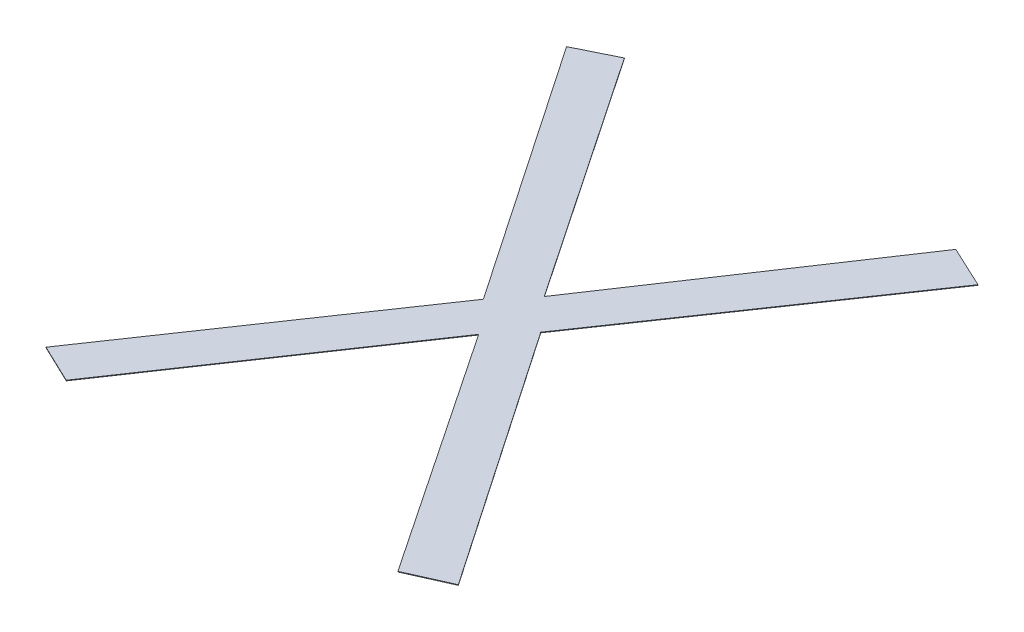
ISO-10303-21;
HEADER;
FILE_DESCRIPTION(('STEP AP214'),'2;1');
FILE_NAME('part.step','',(''),(''),'','','');
FILE_SCHEMA(('AUTOMOTIVE_DESIGN { 1 0 10303 214 1 1 1 1 }'));
ENDSEC;
DATA;
#1=APPLICATION_CONTEXT('core data for automotive mechanical design processes');
#2=APPLICATION_PROTOCOL_DEFINITION('international standard','automotive_design',2000,#1);
#3=PRODUCT_CONTEXT('',#1,'mechanical');
#4=PRODUCT('Part','Part','',(#3));
#5=PRODUCT_RELATED_PRODUCT_CATEGORY('part','',(#4));
#6=PRODUCT_DEFINITION_FORMATION('','',#4);
#7=PRODUCT_DEFINITION_CONTEXT('part definition',#1,'design');
#8=PRODUCT_DEFINITION('design','',#6,#7);
#9=PRODUCT_DEFINITION_SHAPE('','',#8);
#10=(LENGTH_UNIT() NAMED_UNIT(*) SI_UNIT(.MILLI.,.METRE.));
#11=(NAMED_UNIT(*) PLANE_ANGLE_UNIT() SI_UNIT($,.RADIAN.));
#12=(NAMED_UNIT(*) SI_UNIT($,.STERADIAN.) SOLID_ANGLE_UNIT());
#13=UNCERTAINTY_MEASURE_WITH_UNIT(LENGTH_MEASURE(1.E-05),#10,'distance_accuracy_value','');
#14=(GEOMETRIC_REPRESENTATION_CONTEXT(3) GLOBAL_UNCERTAINTY_ASSIGNED_CONTEXT((#13)) GLOBAL_UNIT_ASSIGNED_CONTEXT((#10,
#11,#12)) REPRESENTATION_CONTEXT('',''));
#15=CARTESIAN_POINT('',(0.,0.,0.));
#16=DIRECTION('',(0.,0.,1.));
#17=DIRECTION('',(1.,0.,0.));
#18=AXIS2_PLACEMENT_3D('',#15,#16,#17);
#19=CARTESIAN_POINT('',(0.,1.4,0.));
#20=DIRECTION('',(0.,1.,0.));
#21=DIRECTION('',(0.,0.,1.));
#22=AXIS2_PLACEMENT_3D('',#19,#20,#21);
#23=PLANE('',#22);
#24=DIRECTION('',(0.913517005540234,0.,-0.406800541529635));
#25=VECTOR('',#24,1.);
#26=CARTESIAN_POINT('',(6.44695189779821,1.4,-0.463269226541313));
#27=LINE('',#26,#25);
#28=CARTESIAN_POINT('',(6.36999252401748,1.4,-0.428998255404582));
#29=VERTEX_POINT('',#28);
#30=CARTESIAN_POINT('',(6.44695189779821,1.4,-0.463269226541313));
#31=VERTEX_POINT('',#30);
#32=EDGE_CURVE('E189',#29,#31,#27,.T.);
#33=ORIENTED_EDGE('',*,*,#32,.F.);
#34=DIRECTION('',(0.557245715889214,0.,0.830347645340864));
#35=VECTOR('',#34,1.);
#36=CARTESIAN_POINT('',(6.36999252401748,1.4,-0.428998255404584));
#37=LINE('',#36,#35);
#38=CARTESIAN_POINT('',(6.0665641596841,1.4,-0.881134576366346));
#39=VERTEX_POINT('',#38);
#40=EDGE_CURVE('E131',#39,#29,#37,.T.);
#41=ORIENTED_EDGE('',*,*,#40,.F.);
#42=DIRECTION('',(0.560523866860315,0.,-0.828138270266482));
#43=VECTOR('',#42,1.);
#44=CARTESIAN_POINT('',(6.0665641596841,1.4,-0.881134576366347));
#45=LINE('',#44,#43);
#46=CARTESIAN_POINT('',(5.76012956981241,1.4,-0.428397010296923));
#47=VERTEX_POINT('',#46);
#48=EDGE_CURVE('E139',#47,#39,#45,.T.);
#49=ORIENTED_EDGE('',*,*,#48,.F.);
#50=DIRECTION('',(0.902391441564659,0.,0.430917261421327));
#51=VECTOR('',#50,1.);
#52=CARTESIAN_POINT('',(5.76012956981241,1.4,-0.428397010296922));
#53=LINE('',#52,#51);
#54=CARTESIAN_POINT('',(5.68878181703653,1.4,-0.462467566397764));
#55=VERTEX_POINT('',#54);
#56=EDGE_CURVE('E146',#55,#47,#53,.T.);
#57=ORIENTED_EDGE('',*,*,#56,.F.);
#58=DIRECTION('',(-0.562735666068112,0.,0.826636903443633));
#59=VECTOR('',#58,1.);
#60=CARTESIAN_POINT('',(5.68878181703653,1.4,-0.462467566397764));
#61=LINE('',#60,#59);
#62=CARTESIAN_POINT('',(6.01485708042517,1.4,-0.941459502168422));
#63=VERTEX_POINT('',#62);
#64=EDGE_CURVE('E153',#63,#55,#61,.T.);
#65=ORIENTED_EDGE('',*,*,#64,.F.);
#66=DIRECTION('',(0.562574808787707,0.,0.826746384641309));
#67=VECTOR('',#66,1.);
#68=CARTESIAN_POINT('',(6.01485708042517,1.4,-0.941459502168426));
#69=LINE('',#68,#67);
#70=CARTESIAN_POINT('',(5.68878181703652,1.4,-1.42065185297498));
#71=VERTEX_POINT('',#70);
#72=EDGE_CURVE('E160',#71,#63,#69,.T.);
#73=ORIENTED_EDGE('',*,*,#72,.F.);
#74=DIRECTION('',(-0.897431779599619,0.,0.441153262443634));
#75=VECTOR('',#74,1.);
#76=CARTESIAN_POINT('',(5.68878181703653,1.4,-1.42065185297498));
#77=LINE('',#76,#75);
#78=CARTESIAN_POINT('',(5.76012956981241,1.4,-1.45572448425526));
#79=VERTEX_POINT('',#78);
#80=EDGE_CURVE('E167',#79,#71,#77,.T.);
#81=ORIENTED_EDGE('',*,*,#80,.F.);
#82=DIRECTION('',(-0.559504278234838,0.,-0.828827462525774));
#83=VECTOR('',#82,1.);
#84=CARTESIAN_POINT('',(5.76012956981241,1.4,-1.45572448425526));
#85=LINE('',#84,#83);
#86=CARTESIAN_POINT('',(6.0665641596841,1.4,-1.00178442797051));
#87=VERTEX_POINT('',#86);
#88=EDGE_CURVE('E174',#87,#79,#85,.T.);
#89=ORIENTED_EDGE('',*,*,#88,.F.);
#90=DIRECTION('',(-0.555969854072735,0.,0.831202455098842));
#91=VECTOR('',#90,1.);
#92=CARTESIAN_POINT('',(6.0665641596841,1.4,-1.00178442797051));
#93=LINE('',#92,#91);
#94=CARTESIAN_POINT('',(6.37019293905337,1.4,-1.45572448425526));
#95=VERTEX_POINT('',#94);
#96=EDGE_CURVE('E180',#95,#87,#93,.T.);
#97=ORIENTED_EDGE('',*,*,#96,.F.);
#98=DIRECTION('',(-0.905941274102354,0.,-0.423403363092221));
#99=VECTOR('',#98,1.);
#100=CARTESIAN_POINT('',(6.37019293905337,1.4,-1.45572448425526));
#101=LINE('',#100,#99);
#102=CARTESIAN_POINT('',(6.44695189779821,1.4,-1.41985019283143));
#103=VERTEX_POINT('',#102);
#104=EDGE_CURVE('E112',#103,#95,#101,.T.);
#105=ORIENTED_EDGE('',*,*,#104,.F.);
#106=DIRECTION('',(0.564088273163869,0.,-0.825714490655822));
#107=VECTOR('',#106,1.);
#108=CARTESIAN_POINT('',(6.44695189779821,1.4,-1.41985019283143));
#109=LINE('',#108,#107);
#110=CARTESIAN_POINT('',(6.1202753893019,1.4,-0.941659917204315));
#111=VERTEX_POINT('',#110);
#112=EDGE_CURVE('E113',#111,#103,#109,.T.);
#113=ORIENTED_EDGE('',*,*,#112,.F.);
#114=DIRECTION('',(-0.563927119084817,0.,-0.825824560279421));
#115=VECTOR('',#114,1.);
#116=CARTESIAN_POINT('',(6.1202753893019,1.4,-0.941659917204314));
#117=LINE('',#116,#115);
#118=EDGE_CURVE('E109',#31,#111,#117,.T.);
#119=ORIENTED_EDGE('',*,*,#118,.F.);
#120=EDGE_LOOP('',(#33,#41,#49,#57,#65,#73,#81,#89,#97,#105,#113,#119));
#121=FACE_BOUND('',#120,.T.);
#122=ADVANCED_FACE('F16',(#121),#23,.F.);
#123=CARTESIAN_POINT('',(6.1202753893019,1.401,-0.941659917204314));
#124=DIRECTION('',(0.825824560279421,0.,-0.563927119084817));
#125=DIRECTION('',(-0.563927119084817,0.,-0.825824560279421));
#126=AXIS2_PLACEMENT_3D('',#123,#124,#125);
#127=PLANE('',#126);
#128=DIRECTION('',(-0.563927119084816,0.,-0.825824560279421));
#129=VECTOR('',#128,1.);
#130=CARTESIAN_POINT('',(6.44695189779821,1.401,-0.463269226541313));
#131=LINE('',#130,#129);
#132=CARTESIAN_POINT('',(6.44695189779821,1.401,-0.463269226541313));
#133=VERTEX_POINT('',#132);
#134=CARTESIAN_POINT('',(6.1202753893019,1.401,-0.941659917204315));
#135=VERTEX_POINT('',#134);
#136=EDGE_CURVE('E107',#133,#135,#131,.T.);
#137=ORIENTED_EDGE('',*,*,#136,.F.);
#138=DIRECTION('',(0.,1.,0.));
#139=VECTOR('',#138,1.);
#140=CARTESIAN_POINT('',(6.44695189779821,1.401,-0.463269226541313));
#141=LINE('',#140,#139);
#142=EDGE_CURVE('E127',#31,#133,#141,.T.);
#143=ORIENTED_EDGE('',*,*,#142,.F.);
#144=ORIENTED_EDGE('',*,*,#118,.T.);
#145=DIRECTION('',(0.,1.,0.));
#146=VECTOR('',#145,1.);
#147=CARTESIAN_POINT('',(6.1202753893019,1.401,-0.941659917204315));
#148=LINE('',#147,#146);
#149=EDGE_CURVE('E19',#135,#111,#148,.F.);
#150=ORIENTED_EDGE('',*,*,#149,.F.);
#151=EDGE_LOOP('',(#137,#143,#144,#150));
#152=FACE_BOUND('',#151,.T.);
#153=ADVANCED_FACE('F104',(#152),#127,.T.);
#154=CARTESIAN_POINT('',(6.44695189779821,1.401,-1.41985019283143));
#155=DIRECTION('',(0.825714490655822,0.,0.564088273163869));
#156=DIRECTION('',(0.564088273163869,0.,-0.825714490655822));
#157=AXIS2_PLACEMENT_3D('',#154,#155,#156);
#158=PLANE('',#157);
#159=DIRECTION('',(0.564088273163867,0.,-0.825714490655824));
#160=VECTOR('',#159,1.);
#161=CARTESIAN_POINT('',(6.1202753893019,1.401,-0.941659917204314));
#162=LINE('',#161,#160);
#163=CARTESIAN_POINT('',(6.44695189779821,1.401,-1.41985019283143));
#164=VERTEX_POINT('',#163);
#165=EDGE_CURVE('E115',#135,#164,#162,.T.);
#166=ORIENTED_EDGE('',*,*,#165,.F.);
#167=ORIENTED_EDGE('',*,*,#149,.T.);
#168=ORIENTED_EDGE('',*,*,#112,.T.);
#169=DIRECTION('',(0.,1.,0.));
#170=VECTOR('',#169,1.);
#171=CARTESIAN_POINT('',(6.44695189779821,1.401,-1.41985019283143));
#172=LINE('',#171,#170);
#173=EDGE_CURVE('E118',#164,#103,#172,.F.);
#174=ORIENTED_EDGE('',*,*,#173,.F.);
#175=EDGE_LOOP('',(#166,#167,#168,#174));
#176=FACE_BOUND('',#175,.T.);
#177=ADVANCED_FACE('F116',(#176),#158,.T.);
#178=CARTESIAN_POINT('',(6.37019293905337,1.401,-1.45572448425526));
#179=DIRECTION('',(0.423403363092221,0.,-0.905941274102354));
#180=DIRECTION('',(-0.905941274102354,0.,-0.423403363092221));
#181=AXIS2_PLACEMENT_3D('',#178,#179,#180);
#182=PLANE('',#181);
#183=DIRECTION('',(-0.905941274102348,0.,-0.423403363092235));
#184=VECTOR('',#183,1.);
#185=CARTESIAN_POINT('',(6.44695189779821,1.401,-1.41985019283143));
#186=LINE('',#185,#184);
#187=CARTESIAN_POINT('',(6.37019293905337,1.401,-1.45572448425526));
#188=VERTEX_POINT('',#187);
#189=EDGE_CURVE('E122',#164,#188,#186,.T.);
#190=ORIENTED_EDGE('',*,*,#189,.F.);
#191=ORIENTED_EDGE('',*,*,#173,.T.);
#192=ORIENTED_EDGE('',*,*,#104,.T.);
#193=DIRECTION('',(0.,1.,0.));
#194=VECTOR('',#193,1.);
#195=CARTESIAN_POINT('',(6.37019293905337,1.401,-1.45572448425526));
#196=LINE('',#195,#194);
#197=EDGE_CURVE('E177',#188,#95,#196,.F.);
#198=ORIENTED_EDGE('',*,*,#197,.F.);
#199=EDGE_LOOP('',(#190,#191,#192,#198));
#200=FACE_BOUND('',#199,.T.);
#201=ADVANCED_FACE('F206',(#200),#182,.T.);
#202=CARTESIAN_POINT('',(6.0665641596841,1.401,-1.00178442797051));
#203=DIRECTION('',(-0.831202455098842,0.,-0.555969854072735));
#204=DIRECTION('',(-0.555969854072735,0.,0.831202455098842));
#205=AXIS2_PLACEMENT_3D('',#202,#203,#204);
#206=PLANE('',#205);
#207=DIRECTION('',(-0.555969854072735,0.,0.831202455098841));
#208=VECTOR('',#207,1.);
#209=CARTESIAN_POINT('',(6.37019293905337,1.401,-1.45572448425526));
#210=LINE('',#209,#208);
#211=CARTESIAN_POINT('',(6.0665641596841,1.401,-1.00178442797051));
#212=VERTEX_POINT('',#211);
#213=EDGE_CURVE('E173',#188,#212,#210,.T.);
#214=ORIENTED_EDGE('',*,*,#213,.F.);
#215=ORIENTED_EDGE('',*,*,#197,.T.);
#216=ORIENTED_EDGE('',*,*,#96,.T.);
#217=DIRECTION('',(0.,1.,0.));
#218=VECTOR('',#217,1.);
#219=CARTESIAN_POINT('',(6.0665641596841,1.401,-1.00178442797051));
#220=LINE('',#219,#218);
#221=EDGE_CURVE('E170',#212,#87,#220,.F.);
#222=ORIENTED_EDGE('',*,*,#221,.F.);
#223=EDGE_LOOP('',(#214,#215,#216,#222));
#224=FACE_BOUND('',#223,.T.);
#225=ADVANCED_FACE('F210',(#224),#206,.T.);
#226=CARTESIAN_POINT('',(5.76012956981241,1.401,-1.45572448425526));
#227=DIRECTION('',(0.828827462525774,0.,-0.559504278234838));
#228=DIRECTION('',(-0.559504278234838,0.,-0.828827462525774));
#229=AXIS2_PLACEMENT_3D('',#226,#227,#228);
#230=PLANE('',#229);
#231=DIRECTION('',(-0.559504278234836,0.,-0.828827462525776));
#232=VECTOR('',#231,1.);
#233=CARTESIAN_POINT('',(6.0665641596841,1.401,-1.00178442797051));
#234=LINE('',#233,#232);
#235=CARTESIAN_POINT('',(5.76012956981241,1.401,-1.45572448425526));
#236=VERTEX_POINT('',#235);
#237=EDGE_CURVE('E166',#212,#236,#234,.T.);
#238=ORIENTED_EDGE('',*,*,#237,.F.);
#239=ORIENTED_EDGE('',*,*,#221,.T.);
#240=ORIENTED_EDGE('',*,*,#88,.T.);
#241=DIRECTION('',(0.,1.,0.));
#242=VECTOR('',#241,1.);
#243=CARTESIAN_POINT('',(5.76012956981241,1.401,-1.45572448425526));
#244=LINE('',#243,#242);
#245=EDGE_CURVE('E163',#236,#79,#244,.F.);
#246=ORIENTED_EDGE('',*,*,#245,.F.);
#247=EDGE_LOOP('',(#238,#239,#240,#246));
#248=FACE_BOUND('',#247,.T.);
#249=ADVANCED_FACE('F212',(#248),#230,.T.);
#250=CARTESIAN_POINT('',(5.68878181703653,1.401,-1.42065185297498));
#251=DIRECTION('',(-0.441153262443634,0.,-0.897431779599619));
#252=DIRECTION('',(-0.897431779599619,0.,0.441153262443634));
#253=AXIS2_PLACEMENT_3D('',#250,#251,#252);
#254=PLANE('',#253);
#255=DIRECTION('',(-0.897431779599611,0.,0.441153262443649));
#256=VECTOR('',#255,1.);
#257=CARTESIAN_POINT('',(5.76012956981241,1.401,-1.45572448425526));
#258=LINE('',#257,#256);
#259=CARTESIAN_POINT('',(5.68878181703653,1.401,-1.42065185297498));
#260=VERTEX_POINT('',#259);
#261=EDGE_CURVE('E159',#236,#260,#258,.T.);
#262=ORIENTED_EDGE('',*,*,#261,.F.);
#263=ORIENTED_EDGE('',*,*,#245,.T.);
#264=ORIENTED_EDGE('',*,*,#80,.T.);
#265=DIRECTION('',(0.,1.,0.));
#266=VECTOR('',#265,1.);
#267=CARTESIAN_POINT('',(5.68878181703652,1.401,-1.42065185297498));
#268=LINE('',#267,#266);
#269=EDGE_CURVE('E156',#260,#71,#268,.F.);
#270=ORIENTED_EDGE('',*,*,#269,.F.);
#271=EDGE_LOOP('',(#262,#263,#264,#270));
#272=FACE_BOUND('',#271,.T.);
#273=ADVANCED_FACE('F215',(#272),#254,.T.);
#274=CARTESIAN_POINT('',(6.01485708042517,1.401,-0.941459502168426));
#275=DIRECTION('',(-0.826746384641309,0.,0.562574808787707));
#276=DIRECTION('',(0.562574808787707,0.,0.826746384641309));
#277=AXIS2_PLACEMENT_3D('',#274,#275,#276);
#278=PLANE('',#277);
#279=DIRECTION('',(0.562574808787695,0.,0.826746384641317));
#280=VECTOR('',#279,1.);
#281=CARTESIAN_POINT('',(5.68878181703653,1.401,-1.42065185297498));
#282=LINE('',#281,#280);
#283=CARTESIAN_POINT('',(6.01485708042517,1.401,-0.941459502168424));
#284=VERTEX_POINT('',#283);
#285=EDGE_CURVE('E152',#260,#284,#282,.T.);
#286=ORIENTED_EDGE('',*,*,#285,.F.);
#287=ORIENTED_EDGE('',*,*,#269,.T.);
#288=ORIENTED_EDGE('',*,*,#72,.T.);
#289=DIRECTION('',(0.,1.,0.));
#290=VECTOR('',#289,1.);
#291=CARTESIAN_POINT('',(6.01485708042517,1.401,-0.941459502168423));
#292=LINE('',#291,#290);
#293=EDGE_CURVE('E149',#284,#63,#292,.F.);
#294=ORIENTED_EDGE('',*,*,#293,.F.);
#295=EDGE_LOOP('',(#286,#287,#288,#294));
#296=FACE_BOUND('',#295,.T.);
#297=ADVANCED_FACE('F219',(#296),#278,.T.);
#298=CARTESIAN_POINT('',(5.68878181703653,1.401,-0.462467566397764));
#299=DIRECTION('',(-0.826636903443633,0.,-0.562735666068112));
#300=DIRECTION('',(-0.562735666068112,0.,0.826636903443633));
#301=AXIS2_PLACEMENT_3D('',#298,#299,#300);
#302=PLANE('',#301);
#303=DIRECTION('',(-0.562735666068105,0.,0.826636903443638));
#304=VECTOR('',#303,1.);
#305=CARTESIAN_POINT('',(6.01485708042517,1.401,-0.941459502168426));
#306=LINE('',#305,#304);
#307=CARTESIAN_POINT('',(5.68878181703653,1.401,-0.462467566397764));
#308=VERTEX_POINT('',#307);
#309=EDGE_CURVE('E145',#284,#308,#306,.T.);
#310=ORIENTED_EDGE('',*,*,#309,.F.);
#311=ORIENTED_EDGE('',*,*,#293,.T.);
#312=ORIENTED_EDGE('',*,*,#64,.T.);
#313=DIRECTION('',(0.,1.,0.));
#314=VECTOR('',#313,1.);
#315=CARTESIAN_POINT('',(5.68878181703653,1.401,-0.462467566397764));
#316=LINE('',#315,#314);
#317=EDGE_CURVE('E142',#308,#55,#316,.F.);
#318=ORIENTED_EDGE('',*,*,#317,.F.);
#319=EDGE_LOOP('',(#310,#311,#312,#318));
#320=FACE_BOUND('',#319,.T.);
#321=ADVANCED_FACE('F221',(#320),#302,.T.);
#322=CARTESIAN_POINT('',(5.76012956981241,1.401,-0.428397010296922));
#323=DIRECTION('',(-0.430917261421327,0.,0.902391441564659));
#324=DIRECTION('',(0.902391441564659,0.,0.430917261421327));
#325=AXIS2_PLACEMENT_3D('',#322,#323,#324);
#326=PLANE('',#325);
#327=DIRECTION('',(0.902391441564658,0.,0.43091726142133));
#328=VECTOR('',#327,1.);
#329=CARTESIAN_POINT('',(5.68878181703653,1.401,-0.462467566397764));
#330=LINE('',#329,#328);
#331=CARTESIAN_POINT('',(5.76012956981241,1.401,-0.428397010296922));
#332=VERTEX_POINT('',#331);
#333=EDGE_CURVE('E138',#308,#332,#330,.T.);
#334=ORIENTED_EDGE('',*,*,#333,.F.);
#335=ORIENTED_EDGE('',*,*,#317,.T.);
#336=ORIENTED_EDGE('',*,*,#56,.T.);
#337=DIRECTION('',(0.,1.,0.));
#338=VECTOR('',#337,1.);
#339=CARTESIAN_POINT('',(5.76012956981241,1.401,-0.428397010296923));
#340=LINE('',#339,#338);
#341=EDGE_CURVE('E134',#332,#47,#340,.F.);
#342=ORIENTED_EDGE('',*,*,#341,.F.);
#343=EDGE_LOOP('',(#334,#335,#336,#342));
#344=FACE_BOUND('',#343,.T.);
#345=ADVANCED_FACE('F224',(#344),#326,.T.);
#346=CARTESIAN_POINT('',(6.0665641596841,1.401,-0.881134576366347));
#347=DIRECTION('',(0.828138270266482,0.,0.560523866860315));
#348=DIRECTION('',(0.560523866860315,0.,-0.828138270266482));
#349=AXIS2_PLACEMENT_3D('',#346,#347,#348);
#350=PLANE('',#349);
#351=DIRECTION('',(0.560523866860313,0.,-0.828138270266483));
#352=VECTOR('',#351,1.);
#353=CARTESIAN_POINT('',(5.76012956981241,1.401,-0.428397010296922));
#354=LINE('',#353,#352);
#355=CARTESIAN_POINT('',(6.0665641596841,1.401,-0.881134576366347));
#356=VERTEX_POINT('',#355);
#357=EDGE_CURVE('E135',#332,#356,#354,.T.);
#358=ORIENTED_EDGE('',*,*,#357,.F.);
#359=ORIENTED_EDGE('',*,*,#341,.T.);
#360=ORIENTED_EDGE('',*,*,#48,.T.);
#361=DIRECTION('',(0.,1.,0.));
#362=VECTOR('',#361,1.);
#363=CARTESIAN_POINT('',(6.0665641596841,1.401,-0.881134576366346));
#364=LINE('',#363,#362);
#365=EDGE_CURVE('E133',#356,#39,#364,.F.);
#366=ORIENTED_EDGE('',*,*,#365,.F.);
#367=EDGE_LOOP('',(#358,#359,#360,#366));
#368=FACE_BOUND('',#367,.T.);
#369=ADVANCED_FACE('F227',(#368),#350,.T.);
#370=CARTESIAN_POINT('',(6.36999252401748,1.401,-0.428998255404584));
#371=DIRECTION('',(-0.830347645340864,0.,0.557245715889214));
#372=DIRECTION('',(0.557245715889214,0.,0.830347645340864));
#373=AXIS2_PLACEMENT_3D('',#370,#371,#372);
#374=PLANE('',#373);
#375=DIRECTION('',(0.557245715889212,0.,0.830347645340865));
#376=VECTOR('',#375,1.);
#377=CARTESIAN_POINT('',(6.0665641596841,1.401,-0.881134576366347));
#378=LINE('',#377,#376);
#379=CARTESIAN_POINT('',(6.36999252401748,1.401,-0.428998255404583));
#380=VERTEX_POINT('',#379);
#381=EDGE_CURVE('E25',#356,#380,#378,.T.);
#382=ORIENTED_EDGE('',*,*,#381,.F.);
#383=ORIENTED_EDGE('',*,*,#365,.T.);
#384=ORIENTED_EDGE('',*,*,#40,.T.);
#385=DIRECTION('',(0.,1.,0.));
#386=VECTOR('',#385,1.);
#387=CARTESIAN_POINT('',(6.36999252401748,1.401,-0.428998255404582));
#388=LINE('',#387,#386);
#389=EDGE_CURVE('E34',#380,#29,#388,.F.);
#390=ORIENTED_EDGE('',*,*,#389,.F.);
#391=EDGE_LOOP('',(#382,#383,#384,#390));
#392=FACE_BOUND('',#391,.T.);
#393=ADVANCED_FACE('F228',(#392),#374,.T.);
#394=CARTESIAN_POINT('',(6.44695189779821,1.401,-0.463269226541313));
#395=DIRECTION('',(0.406800541529635,0.,0.913517005540234));
#396=DIRECTION('',(0.913517005540234,0.,-0.406800541529635));
#397=AXIS2_PLACEMENT_3D('',#394,#395,#396);
#398=PLANE('',#397);
#399=DIRECTION('',(0.913517005540244,0.,-0.406800541529612));
#400=VECTOR('',#399,1.);
#401=CARTESIAN_POINT('',(6.36999252401748,1.401,-0.428998255404584));
#402=LINE('',#401,#400);
#403=EDGE_CURVE('E11',#380,#133,#402,.T.);
#404=ORIENTED_EDGE('',*,*,#403,.F.);
#405=ORIENTED_EDGE('',*,*,#389,.T.);
#406=ORIENTED_EDGE('',*,*,#32,.T.);
#407=ORIENTED_EDGE('',*,*,#142,.T.);
#408=EDGE_LOOP('',(#404,#405,#406,#407));
#409=FACE_BOUND('',#408,.T.);
#410=ADVANCED_FACE('F232',(#409),#398,.T.);
#411=CARTESIAN_POINT('',(0.,1.401,0.));
#412=DIRECTION('',(0.,1.,0.));
#413=DIRECTION('',(0.,0.,1.));
#414=AXIS2_PLACEMENT_3D('',#411,#412,#413);
#415=PLANE('',#414);
#416=ORIENTED_EDGE('',*,*,#381,.T.);
#417=ORIENTED_EDGE('',*,*,#403,.T.);
#418=ORIENTED_EDGE('',*,*,#136,.T.);
#419=ORIENTED_EDGE('',*,*,#165,.T.);
#420=ORIENTED_EDGE('',*,*,#189,.T.);
#421=ORIENTED_EDGE('',*,*,#213,.T.);
#422=ORIENTED_EDGE('',*,*,#237,.T.);
#423=ORIENTED_EDGE('',*,*,#261,.T.);
#424=ORIENTED_EDGE('',*,*,#285,.T.);
#425=ORIENTED_EDGE('',*,*,#309,.T.);
#426=ORIENTED_EDGE('',*,*,#333,.T.);
#427=ORIENTED_EDGE('',*,*,#357,.T.);
#428=EDGE_LOOP('',(#416,#417,#418,#419,#420,#421,#422,#423,#424,#425,#426,#427));
#429=FACE_BOUND('',#428,.T.);
#430=ADVANCED_FACE('F125',(#429),#415,.T.);
#431=CLOSED_SHELL('',(#122,#153,#177,#201,#225,#249,#273,#297,#321,#345,#369,#393,#410,#430));
#432=MANIFOLD_SOLID_BREP('B1',#431);
#433=ADVANCED_BREP_SHAPE_REPRESENTATION('',(#18,#432),#14);
#434=SHAPE_DEFINITION_REPRESENTATION(#9,#433);
ENDSEC;
END-ISO-10303-21;
